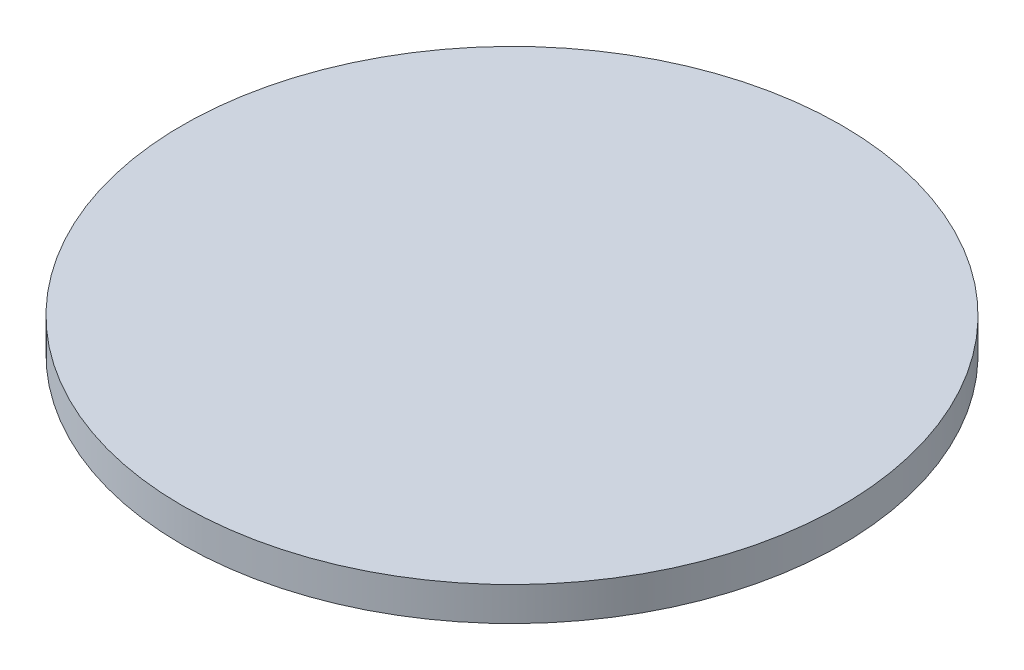
ISO-10303-21;
HEADER;
FILE_DESCRIPTION(('STEP AP214'),'2;1');
FILE_NAME('part.step','',(''),(''),'','','');
FILE_SCHEMA(('AUTOMOTIVE_DESIGN { 1 0 10303 214 1 1 1 1 }'));
ENDSEC;
DATA;
#1=APPLICATION_CONTEXT('core data for automotive mechanical design processes');
#2=APPLICATION_PROTOCOL_DEFINITION('international standard','automotive_design',2000,#1);
#3=PRODUCT_CONTEXT('',#1,'mechanical');
#4=PRODUCT('Part','Part','',(#3));
#5=PRODUCT_RELATED_PRODUCT_CATEGORY('part','',(#4));
#6=PRODUCT_DEFINITION_FORMATION('','',#4);
#7=PRODUCT_DEFINITION_CONTEXT('part definition',#1,'design');
#8=PRODUCT_DEFINITION('design','',#6,#7);
#9=PRODUCT_DEFINITION_SHAPE('','',#8);
#10=(LENGTH_UNIT() NAMED_UNIT(*) SI_UNIT(.MILLI.,.METRE.));
#11=(NAMED_UNIT(*) PLANE_ANGLE_UNIT() SI_UNIT($,.RADIAN.));
#12=(NAMED_UNIT(*) SI_UNIT($,.STERADIAN.) SOLID_ANGLE_UNIT());
#13=UNCERTAINTY_MEASURE_WITH_UNIT(LENGTH_MEASURE(1.E-05),#10,'distance_accuracy_value','');
#14=(GEOMETRIC_REPRESENTATION_CONTEXT(3) GLOBAL_UNCERTAINTY_ASSIGNED_CONTEXT((#13)) GLOBAL_UNIT_ASSIGNED_CONTEXT((#10,
#11,#12)) REPRESENTATION_CONTEXT('',''));
#15=CARTESIAN_POINT('',(0.,0.,0.));
#16=DIRECTION('',(0.,0.,1.));
#17=DIRECTION('',(1.,0.,0.));
#18=AXIS2_PLACEMENT_3D('',#15,#16,#17);
#19=CARTESIAN_POINT('',(0.,5.08,0.));
#20=DIRECTION('',(0.,-1.,0.));
#21=DIRECTION('',(0.,0.,-1.));
#22=AXIS2_PLACEMENT_3D('',#19,#20,#21);
#23=CYLINDRICAL_SURFACE('',#22,49.53);
#24=CARTESIAN_POINT('',(0.,5.08,0.));
#25=DIRECTION('',(0.,1.,0.));
#26=DIRECTION('',(0.,0.,1.));
#27=AXIS2_PLACEMENT_3D('',#24,#25,#26);
#28=CIRCLE('',#27,49.53);
#29=CARTESIAN_POINT('',(0.,5.08,49.53));
#30=VERTEX_POINT('',#29);
#31=EDGE_CURVE('E10',#30,#30,#28,.T.);
#32=ORIENTED_EDGE('',*,*,#31,.F.);
#33=EDGE_LOOP('',(#32));
#34=FACE_BOUND('',#33,.T.);
#35=CARTESIAN_POINT('',(0.,0.,0.));
#36=DIRECTION('',(0.,1.,0.));
#37=DIRECTION('',(0.,0.,1.));
#38=AXIS2_PLACEMENT_3D('',#35,#36,#37);
#39=CIRCLE('',#38,49.53);
#40=CARTESIAN_POINT('',(0.,0.,49.53));
#41=VERTEX_POINT('',#40);
#42=EDGE_CURVE('E35',#41,#41,#39,.T.);
#43=ORIENTED_EDGE('',*,*,#42,.T.);
#44=EDGE_LOOP('',(#43));
#45=FACE_BOUND('',#44,.T.);
#46=ADVANCED_FACE('F32',(#34,#45),#23,.T.);
#47=CARTESIAN_POINT('',(0.,5.08,0.));
#48=DIRECTION('',(0.,1.,0.));
#49=DIRECTION('',(0.,0.,1.));
#50=AXIS2_PLACEMENT_3D('',#47,#48,#49);
#51=PLANE('',#50);
#52=ORIENTED_EDGE('',*,*,#31,.T.);
#53=EDGE_LOOP('',(#52));
#54=FACE_BOUND('',#53,.T.);
#55=ADVANCED_FACE('F49',(#54),#51,.T.);
#56=CARTESIAN_POINT('',(0.,0.,0.));
#57=DIRECTION('',(0.,1.,0.));
#58=DIRECTION('',(0.,0.,1.));
#59=AXIS2_PLACEMENT_3D('',#56,#57,#58);
#60=PLANE('',#59);
#61=ORIENTED_EDGE('',*,*,#42,.F.);
#62=EDGE_LOOP('',(#61));
#63=FACE_BOUND('',#62,.T.);
#64=ADVANCED_FACE('F47',(#63),#60,.F.);
#65=CLOSED_SHELL('',(#46,#55,#64));
#66=MANIFOLD_SOLID_BREP('B2',#65);
#67=ADVANCED_BREP_SHAPE_REPRESENTATION('',(#18,#66),#14);
#68=SHAPE_DEFINITION_REPRESENTATION(#9,#67);
ENDSEC;
END-ISO-10303-21;
